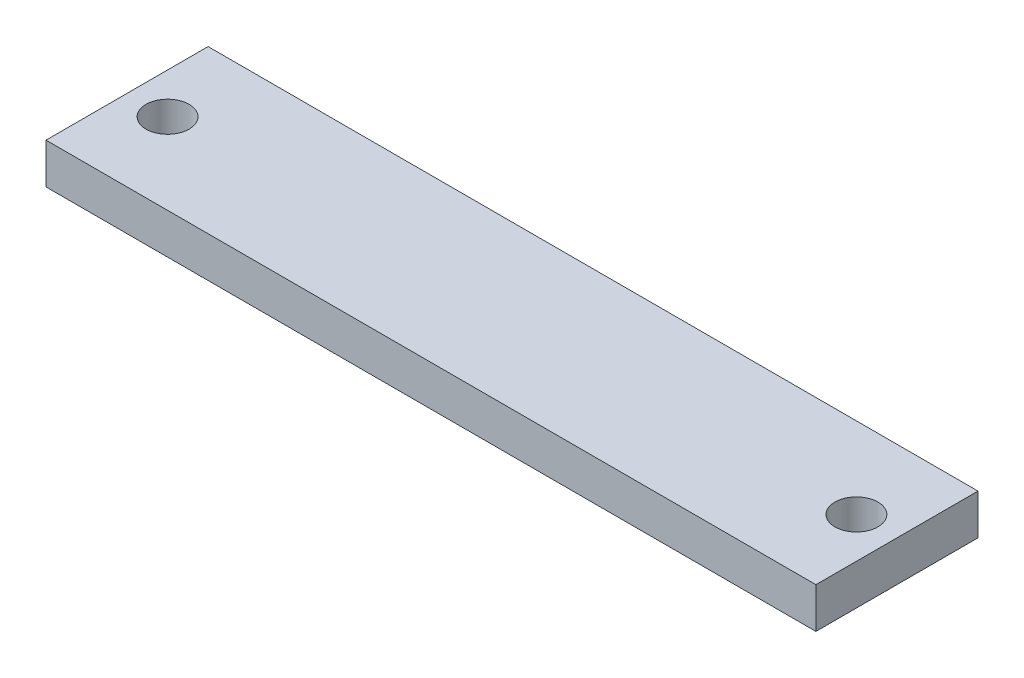
ISO-10303-21;
HEADER;
FILE_DESCRIPTION(('STEP AP214'),'2;1');
FILE_NAME('part.step','',(''),(''),'','','');
FILE_SCHEMA(('AUTOMOTIVE_DESIGN { 1 0 10303 214 1 1 1 1 }'));
ENDSEC;
DATA;
#1=APPLICATION_CONTEXT('core data for automotive mechanical design processes');
#2=APPLICATION_PROTOCOL_DEFINITION('international standard','automotive_design',2000,#1);
#3=PRODUCT_CONTEXT('',#1,'mechanical');
#4=PRODUCT('Part','Part','',(#3));
#5=PRODUCT_RELATED_PRODUCT_CATEGORY('part','',(#4));
#6=PRODUCT_DEFINITION_FORMATION('','',#4);
#7=PRODUCT_DEFINITION_CONTEXT('part definition',#1,'design');
#8=PRODUCT_DEFINITION('design','',#6,#7);
#9=PRODUCT_DEFINITION_SHAPE('','',#8);
#10=(LENGTH_UNIT() NAMED_UNIT(*) SI_UNIT(.MILLI.,.METRE.));
#11=(NAMED_UNIT(*) PLANE_ANGLE_UNIT() SI_UNIT($,.RADIAN.));
#12=(NAMED_UNIT(*) SI_UNIT($,.STERADIAN.) SOLID_ANGLE_UNIT());
#13=UNCERTAINTY_MEASURE_WITH_UNIT(LENGTH_MEASURE(1.E-05),#10,'distance_accuracy_value','');
#14=(GEOMETRIC_REPRESENTATION_CONTEXT(3) GLOBAL_UNCERTAINTY_ASSIGNED_CONTEXT((#13)) GLOBAL_UNIT_ASSIGNED_CONTEXT((#10,
#11,#12)) REPRESENTATION_CONTEXT('',''));
#15=CARTESIAN_POINT('',(0.,0.,0.));
#16=DIRECTION('',(0.,0.,1.));
#17=DIRECTION('',(1.,0.,0.));
#18=AXIS2_PLACEMENT_3D('',#15,#16,#17);
#19=CARTESIAN_POINT('',(120.65,12.7,25.4));
#20=DIRECTION('',(-1.,0.,0.));
#21=DIRECTION('',(0.,0.,1.));
#22=AXIS2_PLACEMENT_3D('',#19,#20,#21);
#23=PLANE('',#22);
#24=DIRECTION('',(0.,0.,-1.));
#25=VECTOR('',#24,1.);
#26=CARTESIAN_POINT('',(120.65,0.,25.4));
#27=LINE('',#26,#25);
#28=CARTESIAN_POINT('',(120.65,0.,25.4));
#29=VERTEX_POINT('',#28);
#30=CARTESIAN_POINT('',(120.65,0.,-25.4));
#31=VERTEX_POINT('',#30);
#32=EDGE_CURVE('E104',#29,#31,#27,.T.);
#33=ORIENTED_EDGE('',*,*,#32,.T.);
#34=DIRECTION('',(0.,-1.,0.));
#35=VECTOR('',#34,1.);
#36=CARTESIAN_POINT('',(120.65,12.7,-25.4));
#37=LINE('',#36,#35);
#38=CARTESIAN_POINT('',(120.65,12.7,-25.4));
#39=VERTEX_POINT('',#38);
#40=EDGE_CURVE('E11',#39,#31,#37,.T.);
#41=ORIENTED_EDGE('',*,*,#40,.F.);
#42=DIRECTION('',(0.,0.,-1.));
#43=VECTOR('',#42,1.);
#44=CARTESIAN_POINT('',(120.65,12.7,25.4));
#45=LINE('',#44,#43);
#46=CARTESIAN_POINT('',(120.65,12.7,25.4));
#47=VERTEX_POINT('',#46);
#48=EDGE_CURVE('E92',#47,#39,#45,.T.);
#49=ORIENTED_EDGE('',*,*,#48,.F.);
#50=DIRECTION('',(0.,-1.,0.));
#51=VECTOR('',#50,1.);
#52=CARTESIAN_POINT('',(120.65,12.7,25.4));
#53=LINE('',#52,#51);
#54=EDGE_CURVE('E100',#47,#29,#53,.T.);
#55=ORIENTED_EDGE('',*,*,#54,.T.);
#56=EDGE_LOOP('',(#33,#41,#49,#55));
#57=FACE_BOUND('',#56,.T.);
#58=ADVANCED_FACE('F41',(#57),#23,.F.);
#59=CARTESIAN_POINT('',(-120.65,12.7,-25.4));
#60=DIRECTION('',(0.,0.,1.));
#61=DIRECTION('',(1.,0.,0.));
#62=AXIS2_PLACEMENT_3D('',#59,#60,#61);
#63=PLANE('',#62);
#64=DIRECTION('',(-1.,0.,0.));
#65=VECTOR('',#64,1.);
#66=CARTESIAN_POINT('',(-120.65,0.,-25.4));
#67=LINE('',#66,#65);
#68=CARTESIAN_POINT('',(-120.65,0.,-25.4));
#69=VERTEX_POINT('',#68);
#70=EDGE_CURVE('E96',#31,#69,#67,.T.);
#71=ORIENTED_EDGE('',*,*,#70,.T.);
#72=DIRECTION('',(0.,-1.,0.));
#73=VECTOR('',#72,1.);
#74=CARTESIAN_POINT('',(-120.65,12.7,-25.4));
#75=LINE('',#74,#73);
#76=CARTESIAN_POINT('',(-120.65,12.7,-25.4));
#77=VERTEX_POINT('',#76);
#78=EDGE_CURVE('E49',#77,#69,#75,.T.);
#79=ORIENTED_EDGE('',*,*,#78,.F.);
#80=DIRECTION('',(-1.,0.,0.));
#81=VECTOR('',#80,1.);
#82=CARTESIAN_POINT('',(-120.65,12.7,-25.4));
#83=LINE('',#82,#81);
#84=EDGE_CURVE('E87',#39,#77,#83,.T.);
#85=ORIENTED_EDGE('',*,*,#84,.F.);
#86=ORIENTED_EDGE('',*,*,#40,.T.);
#87=EDGE_LOOP('',(#71,#79,#85,#86));
#88=FACE_BOUND('',#87,.T.);
#89=ADVANCED_FACE('F95',(#88),#63,.F.);
#90=CARTESIAN_POINT('',(-120.65,12.7,25.4));
#91=DIRECTION('',(1.,0.,0.));
#92=DIRECTION('',(0.,0.,-1.));
#93=AXIS2_PLACEMENT_3D('',#90,#91,#92);
#94=PLANE('',#93);
#95=DIRECTION('',(0.,0.,1.));
#96=VECTOR('',#95,1.);
#97=CARTESIAN_POINT('',(-120.65,0.,25.4));
#98=LINE('',#97,#96);
#99=CARTESIAN_POINT('',(-120.65,0.,25.4));
#100=VERTEX_POINT('',#99);
#101=EDGE_CURVE('E74',#69,#100,#98,.T.);
#102=ORIENTED_EDGE('',*,*,#101,.T.);
#103=DIRECTION('',(0.,-1.,0.));
#104=VECTOR('',#103,1.);
#105=CARTESIAN_POINT('',(-120.65,12.7,25.4));
#106=LINE('',#105,#104);
#107=CARTESIAN_POINT('',(-120.65,12.7,25.4));
#108=VERTEX_POINT('',#107);
#109=EDGE_CURVE('E97',#108,#100,#106,.T.);
#110=ORIENTED_EDGE('',*,*,#109,.F.);
#111=DIRECTION('',(0.,0.,1.));
#112=VECTOR('',#111,1.);
#113=CARTESIAN_POINT('',(-120.65,12.7,25.4));
#114=LINE('',#113,#112);
#115=EDGE_CURVE('E90',#77,#108,#114,.T.);
#116=ORIENTED_EDGE('',*,*,#115,.F.);
#117=ORIENTED_EDGE('',*,*,#78,.T.);
#118=EDGE_LOOP('',(#102,#110,#116,#117));
#119=FACE_BOUND('',#118,.T.);
#120=ADVANCED_FACE('F98',(#119),#94,.F.);
#121=CARTESIAN_POINT('',(-120.65,12.7,25.4));
#122=DIRECTION('',(0.,0.,-1.));
#123=DIRECTION('',(-1.,0.,0.));
#124=AXIS2_PLACEMENT_3D('',#121,#122,#123);
#125=PLANE('',#124);
#126=DIRECTION('',(1.,0.,0.));
#127=VECTOR('',#126,1.);
#128=CARTESIAN_POINT('',(-120.65,0.,25.4));
#129=LINE('',#128,#127);
#130=EDGE_CURVE('E80',#100,#29,#129,.T.);
#131=ORIENTED_EDGE('',*,*,#130,.T.);
#132=ORIENTED_EDGE('',*,*,#54,.F.);
#133=DIRECTION('',(1.,0.,0.));
#134=VECTOR('',#133,1.);
#135=CARTESIAN_POINT('',(-120.65,12.7,25.4));
#136=LINE('',#135,#134);
#137=EDGE_CURVE('E57',#108,#47,#136,.T.);
#138=ORIENTED_EDGE('',*,*,#137,.F.);
#139=ORIENTED_EDGE('',*,*,#109,.T.);
#140=EDGE_LOOP('',(#131,#132,#138,#139));
#141=FACE_BOUND('',#140,.T.);
#142=ADVANCED_FACE('F112',(#141),#125,.F.);
#143=CARTESIAN_POINT('',(0.,12.7,0.));
#144=DIRECTION('',(0.,-1.,0.));
#145=DIRECTION('',(0.,0.,-1.));
#146=AXIS2_PLACEMENT_3D('',#143,#144,#145);
#147=PLANE('',#146);
#148=CARTESIAN_POINT('',(-107.95,12.7,0.));
#149=DIRECTION('',(0.,1.,0.));
#150=DIRECTION('',(0.,0.,1.));
#151=AXIS2_PLACEMENT_3D('',#148,#149,#150);
#152=CIRCLE('',#151,6.74623999999982);
#153=CARTESIAN_POINT('',(-107.95,12.7,6.74623999999983));
#154=VERTEX_POINT('',#153);
#155=EDGE_CURVE('E126',#154,#154,#152,.T.);
#156=ORIENTED_EDGE('',*,*,#155,.F.);
#157=EDGE_LOOP('',(#156));
#158=FACE_BOUND('',#157,.T.);
#159=CARTESIAN_POINT('',(107.95,12.7,0.));
#160=DIRECTION('',(0.,1.,0.));
#161=DIRECTION('',(0.,0.,1.));
#162=AXIS2_PLACEMENT_3D('',#159,#160,#161);
#163=CIRCLE('',#162,6.74623999999982);
#164=CARTESIAN_POINT('',(107.95,12.7,6.74623999999979));
#165=VERTEX_POINT('',#164);
#166=EDGE_CURVE('E120',#165,#165,#163,.T.);
#167=ORIENTED_EDGE('',*,*,#166,.F.);
#168=EDGE_LOOP('',(#167));
#169=FACE_BOUND('',#168,.T.);
#170=ORIENTED_EDGE('',*,*,#48,.T.);
#171=ORIENTED_EDGE('',*,*,#84,.T.);
#172=ORIENTED_EDGE('',*,*,#115,.T.);
#173=ORIENTED_EDGE('',*,*,#137,.T.);
#174=EDGE_LOOP('',(#170,#171,#172,#173));
#175=FACE_BOUND('',#174,.T.);
#176=ADVANCED_FACE('F88',(#158,#169,#175),#147,.F.);
#177=CARTESIAN_POINT('',(0.,0.,0.));
#178=DIRECTION('',(0.,-1.,0.));
#179=DIRECTION('',(0.,0.,-1.));
#180=AXIS2_PLACEMENT_3D('',#177,#178,#179);
#181=PLANE('',#180);
#182=CARTESIAN_POINT('',(-107.95,0.,0.));
#183=DIRECTION('',(0.,1.,0.));
#184=DIRECTION('',(0.,0.,1.));
#185=AXIS2_PLACEMENT_3D('',#182,#183,#184);
#186=CIRCLE('',#185,6.74623999999982);
#187=CARTESIAN_POINT('',(-107.95,0.,6.74623999999983));
#188=VERTEX_POINT('',#187);
#189=EDGE_CURVE('E123',#188,#188,#186,.T.);
#190=ORIENTED_EDGE('',*,*,#189,.T.);
#191=EDGE_LOOP('',(#190));
#192=FACE_BOUND('',#191,.T.);
#193=CARTESIAN_POINT('',(107.95,0.,0.));
#194=DIRECTION('',(0.,1.,0.));
#195=DIRECTION('',(0.,0.,1.));
#196=AXIS2_PLACEMENT_3D('',#193,#194,#195);
#197=CIRCLE('',#196,6.74623999999982);
#198=CARTESIAN_POINT('',(107.95,0.,6.74623999999979));
#199=VERTEX_POINT('',#198);
#200=EDGE_CURVE('E107',#199,#199,#197,.T.);
#201=ORIENTED_EDGE('',*,*,#200,.T.);
#202=EDGE_LOOP('',(#201));
#203=FACE_BOUND('',#202,.T.);
#204=ORIENTED_EDGE('',*,*,#32,.F.);
#205=ORIENTED_EDGE('',*,*,#130,.F.);
#206=ORIENTED_EDGE('',*,*,#101,.F.);
#207=ORIENTED_EDGE('',*,*,#70,.F.);
#208=EDGE_LOOP('',(#204,#205,#206,#207));
#209=FACE_BOUND('',#208,.T.);
#210=ADVANCED_FACE('F115',(#192,#203,#209),#181,.T.);
#211=CARTESIAN_POINT('',(107.95,12.7,0.));
#212=DIRECTION('',(0.,1.,0.));
#213=DIRECTION('',(0.,0.,1.));
#214=AXIS2_PLACEMENT_3D('',#211,#212,#213);
#215=CYLINDRICAL_SURFACE('',#214,6.74623999999982);
#216=ORIENTED_EDGE('',*,*,#200,.F.);
#217=EDGE_LOOP('',(#216));
#218=FACE_BOUND('',#217,.T.);
#219=ORIENTED_EDGE('',*,*,#166,.T.);
#220=EDGE_LOOP('',(#219));
#221=FACE_BOUND('',#220,.T.);
#222=ADVANCED_FACE('F137',(#218,#221),#215,.F.);
#223=CARTESIAN_POINT('',(-107.95,12.7,0.));
#224=DIRECTION('',(0.,1.,0.));
#225=DIRECTION('',(0.,0.,1.));
#226=AXIS2_PLACEMENT_3D('',#223,#224,#225);
#227=CYLINDRICAL_SURFACE('',#226,6.74623999999982);
#228=ORIENTED_EDGE('',*,*,#189,.F.);
#229=EDGE_LOOP('',(#228));
#230=FACE_BOUND('',#229,.T.);
#231=ORIENTED_EDGE('',*,*,#155,.T.);
#232=EDGE_LOOP('',(#231));
#233=FACE_BOUND('',#232,.T.);
#234=ADVANCED_FACE('F130',(#230,#233),#227,.F.);
#235=CLOSED_SHELL('',(#58,#89,#120,#142,#176,#210,#222,#234));
#236=MANIFOLD_SOLID_BREP('B2',#235);
#237=ADVANCED_BREP_SHAPE_REPRESENTATION('',(#18,#236),#14);
#238=SHAPE_DEFINITION_REPRESENTATION(#9,#237);
ENDSEC;
END-ISO-10303-21;
